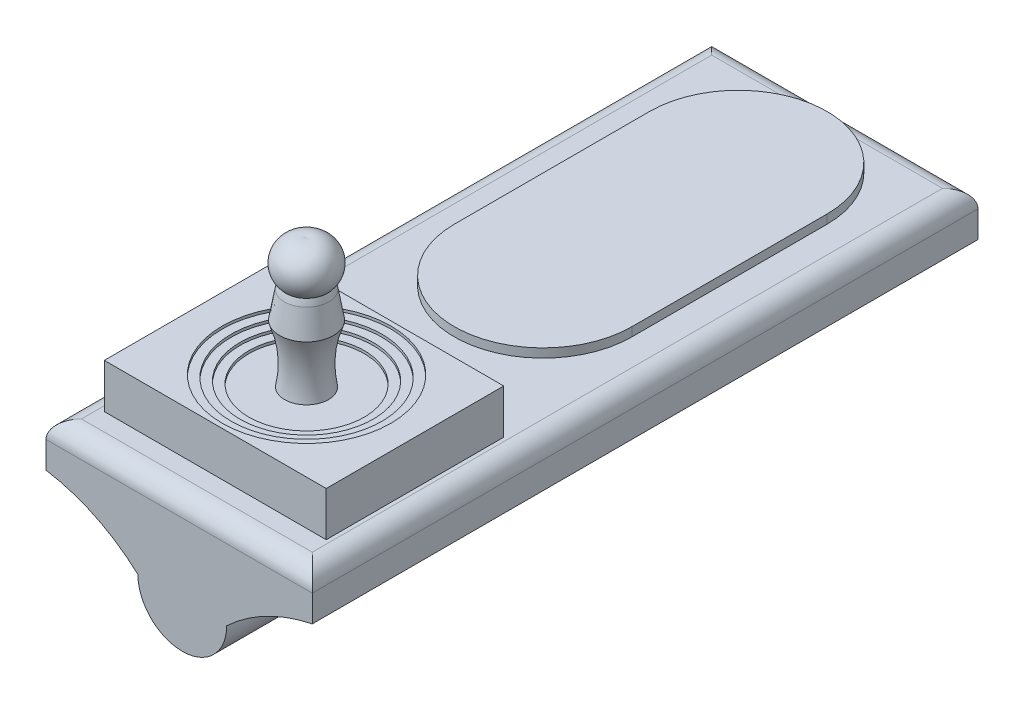
ISO-10303-21;
HEADER;
FILE_DESCRIPTION(('STEP AP214'),'2;1');
FILE_NAME('part.step','',(''),(''),'','','');
FILE_SCHEMA(('AUTOMOTIVE_DESIGN { 1 0 10303 214 1 1 1 1 }'));
ENDSEC;
DATA;
#1=APPLICATION_CONTEXT('core data for automotive mechanical design processes');
#2=APPLICATION_PROTOCOL_DEFINITION('international standard','automotive_design',2000,#1);
#3=PRODUCT_CONTEXT('',#1,'mechanical');
#4=PRODUCT('Part','Part','',(#3));
#5=PRODUCT_RELATED_PRODUCT_CATEGORY('part','',(#4));
#6=PRODUCT_DEFINITION_FORMATION('','',#4);
#7=PRODUCT_DEFINITION_CONTEXT('part definition',#1,'design');
#8=PRODUCT_DEFINITION('design','',#6,#7);
#9=PRODUCT_DEFINITION_SHAPE('','',#8);
#10=(LENGTH_UNIT() NAMED_UNIT(*) SI_UNIT(.MILLI.,.METRE.));
#11=(NAMED_UNIT(*) PLANE_ANGLE_UNIT() SI_UNIT($,.RADIAN.));
#12=(NAMED_UNIT(*) SI_UNIT($,.STERADIAN.) SOLID_ANGLE_UNIT());
#13=UNCERTAINTY_MEASURE_WITH_UNIT(LENGTH_MEASURE(1.E-05),#10,'distance_accuracy_value','');
#14=(GEOMETRIC_REPRESENTATION_CONTEXT(3) GLOBAL_UNCERTAINTY_ASSIGNED_CONTEXT((#13)) GLOBAL_UNIT_ASSIGNED_CONTEXT((#10,
#11,#12)) REPRESENTATION_CONTEXT('',''));
#15=CARTESIAN_POINT('',(0.,0.,0.));
#16=DIRECTION('',(0.,0.,1.));
#17=DIRECTION('',(1.,0.,0.));
#18=AXIS2_PLACEMENT_3D('',#15,#16,#17);
#19=CARTESIAN_POINT('',(-15.3558147471214,10.,-75.));
#20=DIRECTION('',(0.,1.,0.));
#21=DIRECTION('',(-1.,0.,0.));
#22=AXIS2_PLACEMENT_3D('',#19,#20,#21);
#23=PLANE('',#22);
#24=DIRECTION('',(0.,0.,1.));
#25=VECTOR('',#24,1.);
#26=CARTESIAN_POINT('',(12.6441852528786,10.,-75.));
#27=LINE('',#26,#25);
#28=CARTESIAN_POINT('',(12.6441852528786,10.,-2.));
#29=VERTEX_POINT('',#28);
#30=CARTESIAN_POINT('',(12.6441852528786,10.,-73.));
#31=VERTEX_POINT('',#30);
#32=EDGE_CURVE('E192',#29,#31,#27,.F.);
#33=ORIENTED_EDGE('',*,*,#32,.T.);
#34=DIRECTION('',(-1.,0.,0.));
#35=VECTOR('',#34,1.);
#36=CARTESIAN_POINT('',(-15.3558147471214,10.,-73.));
#37=LINE('',#36,#35);
#38=CARTESIAN_POINT('',(-0.355814747121413,10.,-73.));
#39=VERTEX_POINT('',#38);
#40=EDGE_CURVE('E198',#31,#39,#37,.T.);
#41=ORIENTED_EDGE('',*,*,#40,.T.);
#42=CARTESIAN_POINT('',(-0.355814747121413,10.,-63.));
#43=DIRECTION('',(0.,1.,0.));
#44=DIRECTION('',(-1.,0.,0.));
#45=AXIS2_PLACEMENT_3D('',#42,#43,#44);
#46=CIRCLE('',#45,10.);
#47=CARTESIAN_POINT('',(9.64418525287859,10.,-63.));
#48=VERTEX_POINT('',#47);
#49=EDGE_CURVE('E239',#48,#39,#46,.T.);
#50=ORIENTED_EDGE('',*,*,#49,.F.);
#51=DIRECTION('',(0.,0.,-1.));
#52=VECTOR('',#51,1.);
#53=CARTESIAN_POINT('',(9.64418525287859,10.,-41.));
#54=LINE('',#53,#52);
#55=CARTESIAN_POINT('',(9.64418525287859,10.,-41.));
#56=VERTEX_POINT('',#55);
#57=EDGE_CURVE('E241',#56,#48,#54,.T.);
#58=ORIENTED_EDGE('',*,*,#57,.F.);
#59=CARTESIAN_POINT('',(-0.355814747121414,10.,-41.));
#60=DIRECTION('',(0.,1.,0.));
#61=DIRECTION('',(-1.,0.,0.));
#62=AXIS2_PLACEMENT_3D('',#59,#60,#61);
#63=CIRCLE('',#62,10.);
#64=CARTESIAN_POINT('',(-10.3558147471214,10.,-41.));
#65=VERTEX_POINT('',#64);
#66=EDGE_CURVE('E257',#65,#56,#63,.T.);
#67=ORIENTED_EDGE('',*,*,#66,.F.);
#68=DIRECTION('',(0.,0.,1.));
#69=VECTOR('',#68,1.);
#70=CARTESIAN_POINT('',(-10.3558147471214,10.,-41.));
#71=LINE('',#70,#69);
#72=CARTESIAN_POINT('',(-10.3558147471214,10.,-63.));
#73=VERTEX_POINT('',#72);
#74=EDGE_CURVE('E246',#73,#65,#71,.T.);
#75=ORIENTED_EDGE('',*,*,#74,.F.);
#76=EDGE_CURVE('E233',#39,#73,#46,.T.);
#77=ORIENTED_EDGE('',*,*,#76,.F.);
#78=DIRECTION('',(-1.,0.,0.));
#79=VECTOR('',#78,1.);
#80=CARTESIAN_POINT('',(-15.3558147471214,10.,-73.));
#81=LINE('',#80,#79);
#82=CARTESIAN_POINT('',(-13.3558147471214,10.,-73.));
#83=VERTEX_POINT('',#82);
#84=EDGE_CURVE('E195',#39,#83,#81,.T.);
#85=ORIENTED_EDGE('',*,*,#84,.T.);
#86=DIRECTION('',(0.,0.,1.));
#87=VECTOR('',#86,1.);
#88=CARTESIAN_POINT('',(-13.3558147471214,10.,-75.));
#89=LINE('',#88,#87);
#90=CARTESIAN_POINT('',(-13.3558147471214,10.,-2.));
#91=VERTEX_POINT('',#90);
#92=EDGE_CURVE('E185',#83,#91,#89,.T.);
#93=ORIENTED_EDGE('',*,*,#92,.T.);
#94=DIRECTION('',(-1.,0.,0.));
#95=VECTOR('',#94,1.);
#96=CARTESIAN_POINT('',(14.6441852528786,10.,-2.));
#97=LINE('',#96,#95);
#98=EDGE_CURVE('E188',#91,#29,#97,.F.);
#99=ORIENTED_EDGE('',*,*,#98,.T.);
#100=EDGE_LOOP('',(#33,#41,#50,#58,#67,#75,#77,#85,#93,#99));
#101=FACE_BOUND('',#100,.T.);
#102=DIRECTION('',(-1.,0.,0.));
#103=VECTOR('',#102,1.);
#104=CARTESIAN_POINT('',(-12.7865518298798,10.,-24.));
#105=LINE('',#104,#103);
#106=CARTESIAN_POINT('',(12.2134481701202,10.,-24.));
#107=VERTEX_POINT('',#106);
#108=CARTESIAN_POINT('',(-12.7865518298798,10.,-24.));
#109=VERTEX_POINT('',#108);
#110=EDGE_CURVE('E810',#107,#109,#105,.T.);
#111=ORIENTED_EDGE('',*,*,#110,.F.);
#112=DIRECTION('',(0.,0.,-1.));
#113=VECTOR('',#112,1.);
#114=CARTESIAN_POINT('',(12.2134481701202,10.,-24.));
#115=LINE('',#114,#113);
#116=CARTESIAN_POINT('',(12.2134481701202,10.,-4.));
#117=VERTEX_POINT('',#116);
#118=EDGE_CURVE('E788',#117,#107,#115,.T.);
#119=ORIENTED_EDGE('',*,*,#118,.F.);
#120=DIRECTION('',(1.,0.,0.));
#121=VECTOR('',#120,1.);
#122=CARTESIAN_POINT('',(-12.7865518298798,10.,-4.));
#123=LINE('',#122,#121);
#124=CARTESIAN_POINT('',(-12.7865518298798,10.,-4.));
#125=VERTEX_POINT('',#124);
#126=EDGE_CURVE('E797',#125,#117,#123,.T.);
#127=ORIENTED_EDGE('',*,*,#126,.F.);
#128=DIRECTION('',(0.,0.,1.));
#129=VECTOR('',#128,1.);
#130=CARTESIAN_POINT('',(-12.7865518298798,10.,-24.));
#131=LINE('',#130,#129);
#132=EDGE_CURVE('E813',#109,#125,#131,.T.);
#133=ORIENTED_EDGE('',*,*,#132,.F.);
#134=EDGE_LOOP('',(#111,#119,#127,#133));
#135=FACE_BOUND('',#134,.T.);
#136=ADVANCED_FACE('F42',(#101,#135),#23,.T.);
#137=CARTESIAN_POINT('',(14.6441852528786,10.,-75.));
#138=DIRECTION('',(1.,0.,0.));
#139=DIRECTION('',(0.,0.,-1.));
#140=AXIS2_PLACEMENT_3D('',#137,#138,#139);
#141=PLANE('',#140);
#142=DIRECTION('',(0.,1.,0.));
#143=VECTOR('',#142,1.);
#144=CARTESIAN_POINT('',(14.6441852528786,10.,-75.));
#145=LINE('',#144,#143);
#146=CARTESIAN_POINT('',(14.6441852528786,5.,-75.));
#147=VERTEX_POINT('',#146);
#148=CARTESIAN_POINT('',(14.6441852528786,8.,-75.));
#149=VERTEX_POINT('',#148);
#150=EDGE_CURVE('E282',#147,#149,#145,.T.);
#151=ORIENTED_EDGE('',*,*,#150,.T.);
#152=DIRECTION('',(0.,0.,1.));
#153=VECTOR('',#152,1.);
#154=CARTESIAN_POINT('',(14.6441852528786,8.,-75.));
#155=LINE('',#154,#153);
#156=CARTESIAN_POINT('',(14.6441852528786,8.,0.));
#157=VERTEX_POINT('',#156);
#158=EDGE_CURVE('E67',#149,#157,#155,.T.);
#159=ORIENTED_EDGE('',*,*,#158,.T.);
#160=DIRECTION('',(0.,1.,0.));
#161=VECTOR('',#160,1.);
#162=CARTESIAN_POINT('',(14.6441852528786,10.,0.));
#163=LINE('',#162,#161);
#164=CARTESIAN_POINT('',(14.6441852528786,5.,0.));
#165=VERTEX_POINT('',#164);
#166=EDGE_CURVE('E278',#165,#157,#163,.T.);
#167=ORIENTED_EDGE('',*,*,#166,.F.);
#168=DIRECTION('',(0.,0.,1.));
#169=VECTOR('',#168,1.);
#170=CARTESIAN_POINT('',(14.6441852528786,5.,-75.));
#171=LINE('',#170,#169);
#172=EDGE_CURVE('E189',#147,#165,#171,.T.);
#173=ORIENTED_EDGE('',*,*,#172,.F.);
#174=EDGE_LOOP('',(#151,#159,#167,#173));
#175=FACE_BOUND('',#174,.T.);
#176=ADVANCED_FACE('F343',(#175),#141,.T.);
#177=CARTESIAN_POINT('',(18.6814582616072,-14.5882726817091,-75.));
#178=DIRECTION('',(0.,0.,1.));
#179=DIRECTION('',(1.,0.,0.));
#180=AXIS2_PLACEMENT_3D('',#177,#178,#179);
#181=CYLINDRICAL_SURFACE('',#180,20.);
#182=CARTESIAN_POINT('',(18.6814582616072,-14.5882726817091,0.));
#183=DIRECTION('',(0.,0.,-1.));
#184=DIRECTION('',(-1.,0.,0.));
#185=AXIS2_PLACEMENT_3D('',#182,#183,#184);
#186=CIRCLE('',#185,20.);
#187=CARTESIAN_POINT('',(5.,0.,0.));
#188=VERTEX_POINT('',#187);
#189=EDGE_CURVE('E286',#188,#165,#186,.T.);
#190=ORIENTED_EDGE('',*,*,#189,.F.);
#191=DIRECTION('',(0.,0.,1.));
#192=VECTOR('',#191,1.);
#193=CARTESIAN_POINT('',(5.,0.,-75.));
#194=LINE('',#193,#192);
#195=CARTESIAN_POINT('',(5.,0.,-75.));
#196=VERTEX_POINT('',#195);
#197=EDGE_CURVE('E320',#196,#188,#194,.T.);
#198=ORIENTED_EDGE('',*,*,#197,.F.);
#199=CARTESIAN_POINT('',(18.6814582616072,-14.5882726817091,-75.));
#200=DIRECTION('',(0.,0.,-1.));
#201=DIRECTION('',(-1.,0.,0.));
#202=AXIS2_PLACEMENT_3D('',#199,#200,#201);
#203=CIRCLE('',#202,20.);
#204=EDGE_CURVE('E297',#196,#147,#203,.T.);
#205=ORIENTED_EDGE('',*,*,#204,.T.);
#206=ORIENTED_EDGE('',*,*,#172,.T.);
#207=EDGE_LOOP('',(#190,#198,#205,#206));
#208=FACE_BOUND('',#207,.T.);
#209=ADVANCED_FACE('F340',(#208),#181,.F.);
#210=CARTESIAN_POINT('',(0.,0.,-75.));
#211=DIRECTION('',(0.,0.,1.));
#212=DIRECTION('',(1.,0.,0.));
#213=AXIS2_PLACEMENT_3D('',#210,#211,#212);
#214=CYLINDRICAL_SURFACE('',#213,5.);
#215=CARTESIAN_POINT('',(0.,0.,0.));
#216=DIRECTION('',(0.,0.,1.));
#217=DIRECTION('',(1.,0.,0.));
#218=AXIS2_PLACEMENT_3D('',#215,#216,#217);
#219=CIRCLE('',#218,5.);
#220=CARTESIAN_POINT('',(-5.,0.,0.));
#221=VERTEX_POINT('',#220);
#222=EDGE_CURVE('E311',#221,#188,#219,.T.);
#223=ORIENTED_EDGE('',*,*,#222,.F.);
#224=DIRECTION('',(0.,0.,1.));
#225=VECTOR('',#224,1.);
#226=CARTESIAN_POINT('',(-5.,0.,-75.));
#227=LINE('',#226,#225);
#228=CARTESIAN_POINT('',(-5.,0.,-75.));
#229=VERTEX_POINT('',#228);
#230=EDGE_CURVE('E323',#229,#221,#227,.T.);
#231=ORIENTED_EDGE('',*,*,#230,.F.);
#232=CARTESIAN_POINT('',(0.,0.,-75.));
#233=DIRECTION('',(0.,0.,1.));
#234=DIRECTION('',(1.,0.,0.));
#235=AXIS2_PLACEMENT_3D('',#232,#233,#234);
#236=CIRCLE('',#235,5.);
#237=EDGE_CURVE('E293',#229,#196,#236,.T.);
#238=ORIENTED_EDGE('',*,*,#237,.T.);
#239=ORIENTED_EDGE('',*,*,#197,.T.);
#240=EDGE_LOOP('',(#223,#231,#238,#239));
#241=FACE_BOUND('',#240,.T.);
#242=ADVANCED_FACE('F351',(#241),#214,.T.);
#243=CARTESIAN_POINT('',(-18.5066784067701,-14.7502419782216,-75.));
#244=DIRECTION('',(0.,0.,1.));
#245=DIRECTION('',(1.,0.,0.));
#246=AXIS2_PLACEMENT_3D('',#243,#244,#245);
#247=CYLINDRICAL_SURFACE('',#246,20.);
#248=CARTESIAN_POINT('',(-18.5066784067701,-14.7502419782216,0.));
#249=DIRECTION('',(0.,0.,-1.));
#250=DIRECTION('',(-1.,0.,0.));
#251=AXIS2_PLACEMENT_3D('',#248,#249,#250);
#252=CIRCLE('',#251,20.);
#253=CARTESIAN_POINT('',(-15.3558147471214,5.,0.));
#254=VERTEX_POINT('',#253);
#255=EDGE_CURVE('E307',#254,#221,#252,.T.);
#256=ORIENTED_EDGE('',*,*,#255,.F.);
#257=DIRECTION('',(0.,0.,1.));
#258=VECTOR('',#257,1.);
#259=CARTESIAN_POINT('',(-15.3558147471214,5.,-75.));
#260=LINE('',#259,#258);
#261=CARTESIAN_POINT('',(-15.3558147471214,5.,-75.));
#262=VERTEX_POINT('',#261);
#263=EDGE_CURVE('E301',#262,#254,#260,.T.);
#264=ORIENTED_EDGE('',*,*,#263,.F.);
#265=CARTESIAN_POINT('',(-18.5066784067701,-14.7502419782216,-75.));
#266=DIRECTION('',(0.,0.,-1.));
#267=DIRECTION('',(-1.,0.,0.));
#268=AXIS2_PLACEMENT_3D('',#265,#266,#267);
#269=CIRCLE('',#268,20.);
#270=EDGE_CURVE('E289',#262,#229,#269,.T.);
#271=ORIENTED_EDGE('',*,*,#270,.T.);
#272=ORIENTED_EDGE('',*,*,#230,.T.);
#273=EDGE_LOOP('',(#256,#264,#271,#272));
#274=FACE_BOUND('',#273,.T.);
#275=ADVANCED_FACE('F334',(#274),#247,.F.);
#276=CARTESIAN_POINT('',(-15.3558147471214,10.,-75.));
#277=DIRECTION('',(-1.,0.,0.));
#278=DIRECTION('',(0.,0.,1.));
#279=AXIS2_PLACEMENT_3D('',#276,#277,#278);
#280=PLANE('',#279);
#281=DIRECTION('',(0.,-1.,0.));
#282=VECTOR('',#281,1.);
#283=CARTESIAN_POINT('',(-15.3558147471214,10.,0.));
#284=LINE('',#283,#282);
#285=CARTESIAN_POINT('',(-15.3558147471214,8.,0.));
#286=VERTEX_POINT('',#285);
#287=EDGE_CURVE('E304',#286,#254,#284,.T.);
#288=ORIENTED_EDGE('',*,*,#287,.F.);
#289=DIRECTION('',(0.,0.,1.));
#290=VECTOR('',#289,1.);
#291=CARTESIAN_POINT('',(-15.3558147471214,8.,-75.));
#292=LINE('',#291,#290);
#293=CARTESIAN_POINT('',(-15.3558147471214,8.,-75.));
#294=VERTEX_POINT('',#293);
#295=EDGE_CURVE('E11',#286,#294,#292,.F.);
#296=ORIENTED_EDGE('',*,*,#295,.T.);
#297=DIRECTION('',(0.,-1.,0.));
#298=VECTOR('',#297,1.);
#299=CARTESIAN_POINT('',(-15.3558147471214,10.,-75.));
#300=LINE('',#299,#298);
#301=EDGE_CURVE('E285',#294,#262,#300,.T.);
#302=ORIENTED_EDGE('',*,*,#301,.T.);
#303=ORIENTED_EDGE('',*,*,#263,.T.);
#304=EDGE_LOOP('',(#288,#296,#302,#303));
#305=FACE_BOUND('',#304,.T.);
#306=ADVANCED_FACE('F330',(#305),#280,.T.);
#307=CARTESIAN_POINT('',(18.6814582616072,-14.5882726817091,-75.));
#308=DIRECTION('',(0.,0.,-1.));
#309=DIRECTION('',(-1.,0.,0.));
#310=AXIS2_PLACEMENT_3D('',#307,#308,#309);
#311=PLANE('',#310);
#312=CARTESIAN_POINT('',(0.,0.,-75.));
#313=DIRECTION('',(0.,0.,-1.));
#314=DIRECTION('',(-1.,0.,0.));
#315=AXIS2_PLACEMENT_3D('',#312,#313,#314);
#316=CIRCLE('',#315,4.);
#317=CARTESIAN_POINT('',(-4.,0.,-75.));
#318=VERTEX_POINT('',#317);
#319=EDGE_CURVE('E267',#318,#318,#316,.T.);
#320=ORIENTED_EDGE('',*,*,#319,.F.);
#321=EDGE_LOOP('',(#320));
#322=FACE_BOUND('',#321,.T.);
#323=ORIENTED_EDGE('',*,*,#301,.F.);
#324=DIRECTION('',(-1.,0.,0.));
#325=VECTOR('',#324,1.);
#326=CARTESIAN_POINT('',(18.6814582616072,8.,-75.));
#327=LINE('',#326,#325);
#328=EDGE_CURVE('E202',#294,#149,#327,.F.);
#329=ORIENTED_EDGE('',*,*,#328,.T.);
#330=ORIENTED_EDGE('',*,*,#150,.F.);
#331=ORIENTED_EDGE('',*,*,#204,.F.);
#332=ORIENTED_EDGE('',*,*,#237,.F.);
#333=ORIENTED_EDGE('',*,*,#270,.F.);
#334=EDGE_LOOP('',(#323,#329,#330,#331,#332,#333));
#335=FACE_BOUND('',#334,.T.);
#336=ADVANCED_FACE('F366',(#322,#335),#311,.T.);
#337=CARTESIAN_POINT('',(18.6814582616072,-14.5882726817091,0.));
#338=DIRECTION('',(0.,0.,-1.));
#339=DIRECTION('',(-1.,0.,0.));
#340=AXIS2_PLACEMENT_3D('',#337,#338,#339);
#341=PLANE('',#340);
#342=ORIENTED_EDGE('',*,*,#166,.T.);
#343=DIRECTION('',(-1.,0.,0.));
#344=VECTOR('',#343,1.);
#345=CARTESIAN_POINT('',(-15.3558147471214,8.,0.));
#346=LINE('',#345,#344);
#347=EDGE_CURVE('E52',#157,#286,#346,.T.);
#348=ORIENTED_EDGE('',*,*,#347,.T.);
#349=ORIENTED_EDGE('',*,*,#287,.T.);
#350=ORIENTED_EDGE('',*,*,#255,.T.);
#351=ORIENTED_EDGE('',*,*,#222,.T.);
#352=ORIENTED_EDGE('',*,*,#189,.T.);
#353=EDGE_LOOP('',(#342,#348,#349,#350,#351,#352));
#354=FACE_BOUND('',#353,.T.);
#355=ADVANCED_FACE('F336',(#354),#341,.F.);
#356=CARTESIAN_POINT('',(0.,0.,-15.));
#357=DIRECTION('',(0.,0.,-1.));
#358=DIRECTION('',(-1.,0.,0.));
#359=AXIS2_PLACEMENT_3D('',#356,#357,#358);
#360=CYLINDRICAL_SURFACE('',#359,4.);
#361=CARTESIAN_POINT('',(0.,0.,-15.));
#362=DIRECTION('',(0.,0.,-1.));
#363=DIRECTION('',(-1.,0.,0.));
#364=AXIS2_PLACEMENT_3D('',#361,#362,#363);
#365=CIRCLE('',#364,4.);
#366=CARTESIAN_POINT('',(-4.,0.,-15.));
#367=VERTEX_POINT('',#366);
#368=EDGE_CURVE('E274',#367,#367,#365,.T.);
#369=ORIENTED_EDGE('',*,*,#368,.F.);
#370=EDGE_LOOP('',(#369));
#371=FACE_BOUND('',#370,.T.);
#372=ORIENTED_EDGE('',*,*,#319,.T.);
#373=EDGE_LOOP('',(#372));
#374=FACE_BOUND('',#373,.T.);
#375=ADVANCED_FACE('F383',(#371,#374),#360,.F.);
#376=CARTESIAN_POINT('',(0.,0.,-15.));
#377=DIRECTION('',(0.,0.,-1.));
#378=DIRECTION('',(-1.,0.,0.));
#379=AXIS2_PLACEMENT_3D('',#376,#377,#378);
#380=PLANE('',#379);
#381=ORIENTED_EDGE('',*,*,#368,.T.);
#382=EDGE_LOOP('',(#381));
#383=FACE_BOUND('',#382,.T.);
#384=ADVANCED_FACE('F388',(#383),#380,.T.);
#385=CARTESIAN_POINT('',(-0.355814747121414,11.,-41.));
#386=DIRECTION('',(0.,-1.,0.));
#387=DIRECTION('',(1.,0.,0.));
#388=AXIS2_PLACEMENT_3D('',#385,#386,#387);
#389=CYLINDRICAL_SURFACE('',#388,10.);
#390=ORIENTED_EDGE('',*,*,#66,.T.);
#391=DIRECTION('',(0.,-1.,0.));
#392=VECTOR('',#391,1.);
#393=CARTESIAN_POINT('',(9.64418525287859,11.,-41.));
#394=LINE('',#393,#392);
#395=CARTESIAN_POINT('',(9.64418525287859,11.,-41.));
#396=VERTEX_POINT('',#395);
#397=EDGE_CURVE('E254',#396,#56,#394,.T.);
#398=ORIENTED_EDGE('',*,*,#397,.F.);
#399=CARTESIAN_POINT('',(-0.355814747121414,11.,-41.));
#400=DIRECTION('',(0.,1.,0.));
#401=DIRECTION('',(-1.,0.,0.));
#402=AXIS2_PLACEMENT_3D('',#399,#400,#401);
#403=CIRCLE('',#402,10.);
#404=CARTESIAN_POINT('',(-10.3558147471214,11.,-41.));
#405=VERTEX_POINT('',#404);
#406=EDGE_CURVE('E832',#405,#396,#403,.T.);
#407=ORIENTED_EDGE('',*,*,#406,.F.);
#408=DIRECTION('',(0.,-1.,0.));
#409=VECTOR('',#408,1.);
#410=CARTESIAN_POINT('',(-10.3558147471214,11.,-41.));
#411=LINE('',#410,#409);
#412=EDGE_CURVE('E270',#405,#65,#411,.T.);
#413=ORIENTED_EDGE('',*,*,#412,.T.);
#414=EDGE_LOOP('',(#390,#398,#407,#413));
#415=FACE_BOUND('',#414,.T.);
#416=ADVANCED_FACE('F392',(#415),#389,.T.);
#417=CARTESIAN_POINT('',(9.64418525287859,11.,-41.));
#418=DIRECTION('',(-1.,0.,0.));
#419=DIRECTION('',(0.,-1.,0.));
#420=AXIS2_PLACEMENT_3D('',#417,#418,#419);
#421=PLANE('',#420);
#422=ORIENTED_EDGE('',*,*,#57,.T.);
#423=DIRECTION('',(0.,-1.,0.));
#424=VECTOR('',#423,1.);
#425=CARTESIAN_POINT('',(9.64418525287859,11.,-63.));
#426=LINE('',#425,#424);
#427=CARTESIAN_POINT('',(9.64418525287859,11.,-63.));
#428=VERTEX_POINT('',#427);
#429=EDGE_CURVE('E251',#428,#48,#426,.T.);
#430=ORIENTED_EDGE('',*,*,#429,.F.);
#431=DIRECTION('',(0.,0.,-1.));
#432=VECTOR('',#431,1.);
#433=CARTESIAN_POINT('',(9.64418525287859,11.,-41.));
#434=LINE('',#433,#432);
#435=EDGE_CURVE('E836',#396,#428,#434,.T.);
#436=ORIENTED_EDGE('',*,*,#435,.F.);
#437=ORIENTED_EDGE('',*,*,#397,.T.);
#438=EDGE_LOOP('',(#422,#430,#436,#437));
#439=FACE_BOUND('',#438,.T.);
#440=ADVANCED_FACE('F250',(#439),#421,.F.);
#441=CARTESIAN_POINT('',(-0.355814747121413,11.,-63.));
#442=DIRECTION('',(0.,-1.,0.));
#443=DIRECTION('',(1.,0.,0.));
#444=AXIS2_PLACEMENT_3D('',#441,#442,#443);
#445=CYLINDRICAL_SURFACE('',#444,10.);
#446=ORIENTED_EDGE('',*,*,#49,.T.);
#447=ORIENTED_EDGE('',*,*,#76,.T.);
#448=DIRECTION('',(0.,-1.,0.));
#449=VECTOR('',#448,1.);
#450=CARTESIAN_POINT('',(-10.3558147471214,11.,-63.));
#451=LINE('',#450,#449);
#452=CARTESIAN_POINT('',(-10.3558147471214,11.,-63.));
#453=VERTEX_POINT('',#452);
#454=EDGE_CURVE('E263',#453,#73,#451,.T.);
#455=ORIENTED_EDGE('',*,*,#454,.F.);
#456=CARTESIAN_POINT('',(-0.355814747121413,11.,-63.));
#457=DIRECTION('',(0.,1.,0.));
#458=DIRECTION('',(-1.,0.,0.));
#459=AXIS2_PLACEMENT_3D('',#456,#457,#458);
#460=CIRCLE('',#459,10.);
#461=EDGE_CURVE('E261',#428,#453,#460,.T.);
#462=ORIENTED_EDGE('',*,*,#461,.F.);
#463=ORIENTED_EDGE('',*,*,#429,.T.);
#464=EDGE_LOOP('',(#446,#447,#455,#462,#463));
#465=FACE_BOUND('',#464,.T.);
#466=ADVANCED_FACE('F259',(#465),#445,.T.);
#467=CARTESIAN_POINT('',(-10.3558147471214,11.,-41.));
#468=DIRECTION('',(1.,0.,0.));
#469=DIRECTION('',(0.,1.,0.));
#470=AXIS2_PLACEMENT_3D('',#467,#468,#469);
#471=PLANE('',#470);
#472=ORIENTED_EDGE('',*,*,#74,.T.);
#473=ORIENTED_EDGE('',*,*,#412,.F.);
#474=DIRECTION('',(0.,0.,1.));
#475=VECTOR('',#474,1.);
#476=CARTESIAN_POINT('',(-10.3558147471214,11.,-41.));
#477=LINE('',#476,#475);
#478=EDGE_CURVE('E841',#453,#405,#477,.T.);
#479=ORIENTED_EDGE('',*,*,#478,.F.);
#480=ORIENTED_EDGE('',*,*,#454,.T.);
#481=EDGE_LOOP('',(#472,#473,#479,#480));
#482=FACE_BOUND('',#481,.T.);
#483=ADVANCED_FACE('F401',(#482),#471,.F.);
#484=CARTESIAN_POINT('',(-0.355814747121414,11.,-41.));
#485=DIRECTION('',(0.,1.,0.));
#486=DIRECTION('',(-1.,0.,0.));
#487=AXIS2_PLACEMENT_3D('',#484,#485,#486);
#488=PLANE('',#487);
#489=ORIENTED_EDGE('',*,*,#406,.T.);
#490=ORIENTED_EDGE('',*,*,#435,.T.);
#491=ORIENTED_EDGE('',*,*,#461,.T.);
#492=ORIENTED_EDGE('',*,*,#478,.T.);
#493=EDGE_LOOP('',(#489,#490,#491,#492));
#494=FACE_BOUND('',#493,.T.);
#495=ADVANCED_FACE('F404',(#494),#488,.T.);
#496=CARTESIAN_POINT('',(12.2134481701202,15.,-24.));
#497=DIRECTION('',(-1.,0.,0.));
#498=DIRECTION('',(0.,0.,1.));
#499=AXIS2_PLACEMENT_3D('',#496,#497,#498);
#500=PLANE('',#499);
#501=ORIENTED_EDGE('',*,*,#118,.T.);
#502=DIRECTION('',(0.,-1.,0.));
#503=VECTOR('',#502,1.);
#504=CARTESIAN_POINT('',(12.2134481701202,15.,-24.));
#505=LINE('',#504,#503);
#506=CARTESIAN_POINT('',(12.2134481701202,15.,-24.));
#507=VERTEX_POINT('',#506);
#508=EDGE_CURVE('E829',#507,#107,#505,.T.);
#509=ORIENTED_EDGE('',*,*,#508,.F.);
#510=DIRECTION('',(0.,0.,-1.));
#511=VECTOR('',#510,1.);
#512=CARTESIAN_POINT('',(12.2134481701202,15.,-24.));
#513=LINE('',#512,#511);
#514=CARTESIAN_POINT('',(12.2134481701202,15.,-4.));
#515=VERTEX_POINT('',#514);
#516=EDGE_CURVE('E792',#515,#507,#513,.T.);
#517=ORIENTED_EDGE('',*,*,#516,.F.);
#518=DIRECTION('',(0.,-1.,0.));
#519=VECTOR('',#518,1.);
#520=CARTESIAN_POINT('',(12.2134481701202,15.,-4.));
#521=LINE('',#520,#519);
#522=EDGE_CURVE('E806',#515,#117,#521,.T.);
#523=ORIENTED_EDGE('',*,*,#522,.T.);
#524=EDGE_LOOP('',(#501,#509,#517,#523));
#525=FACE_BOUND('',#524,.T.);
#526=ADVANCED_FACE('F408',(#525),#500,.F.);
#527=CARTESIAN_POINT('',(-12.7865518298798,15.,-24.));
#528=DIRECTION('',(0.,0.,1.));
#529=DIRECTION('',(1.,0.,0.));
#530=AXIS2_PLACEMENT_3D('',#527,#528,#529);
#531=PLANE('',#530);
#532=ORIENTED_EDGE('',*,*,#110,.T.);
#533=DIRECTION('',(0.,-1.,0.));
#534=VECTOR('',#533,1.);
#535=CARTESIAN_POINT('',(-12.7865518298798,15.,-24.));
#536=LINE('',#535,#534);
#537=CARTESIAN_POINT('',(-12.7865518298798,15.,-24.));
#538=VERTEX_POINT('',#537);
#539=EDGE_CURVE('E825',#538,#109,#536,.T.);
#540=ORIENTED_EDGE('',*,*,#539,.F.);
#541=DIRECTION('',(-1.,0.,0.));
#542=VECTOR('',#541,1.);
#543=CARTESIAN_POINT('',(-12.7865518298798,15.,-24.));
#544=LINE('',#543,#542);
#545=EDGE_CURVE('E796',#507,#538,#544,.T.);
#546=ORIENTED_EDGE('',*,*,#545,.F.);
#547=ORIENTED_EDGE('',*,*,#508,.T.);
#548=EDGE_LOOP('',(#532,#540,#546,#547));
#549=FACE_BOUND('',#548,.T.);
#550=ADVANCED_FACE('F412',(#549),#531,.F.);
#551=CARTESIAN_POINT('',(-12.7865518298798,15.,-24.));
#552=DIRECTION('',(1.,0.,0.));
#553=DIRECTION('',(0.,0.,-1.));
#554=AXIS2_PLACEMENT_3D('',#551,#552,#553);
#555=PLANE('',#554);
#556=ORIENTED_EDGE('',*,*,#132,.T.);
#557=DIRECTION('',(0.,-1.,0.));
#558=VECTOR('',#557,1.);
#559=CARTESIAN_POINT('',(-12.7865518298798,15.,-4.));
#560=LINE('',#559,#558);
#561=CARTESIAN_POINT('',(-12.7865518298798,15.,-4.));
#562=VERTEX_POINT('',#561);
#563=EDGE_CURVE('E822',#562,#125,#560,.T.);
#564=ORIENTED_EDGE('',*,*,#563,.F.);
#565=DIRECTION('',(0.,0.,1.));
#566=VECTOR('',#565,1.);
#567=CARTESIAN_POINT('',(-12.7865518298798,15.,-24.));
#568=LINE('',#567,#566);
#569=EDGE_CURVE('E800',#538,#562,#568,.T.);
#570=ORIENTED_EDGE('',*,*,#569,.F.);
#571=ORIENTED_EDGE('',*,*,#539,.T.);
#572=EDGE_LOOP('',(#556,#564,#570,#571));
#573=FACE_BOUND('',#572,.T.);
#574=ADVANCED_FACE('F416',(#573),#555,.F.);
#575=CARTESIAN_POINT('',(-12.7865518298798,15.,-4.));
#576=DIRECTION('',(0.,0.,-1.));
#577=DIRECTION('',(-1.,0.,0.));
#578=AXIS2_PLACEMENT_3D('',#575,#576,#577);
#579=PLANE('',#578);
#580=ORIENTED_EDGE('',*,*,#126,.T.);
#581=ORIENTED_EDGE('',*,*,#522,.F.);
#582=DIRECTION('',(1.,0.,0.));
#583=VECTOR('',#582,1.);
#584=CARTESIAN_POINT('',(-12.7865518298798,15.,-4.));
#585=LINE('',#584,#583);
#586=EDGE_CURVE('E803',#562,#515,#585,.T.);
#587=ORIENTED_EDGE('',*,*,#586,.F.);
#588=ORIENTED_EDGE('',*,*,#563,.T.);
#589=EDGE_LOOP('',(#580,#581,#587,#588));
#590=FACE_BOUND('',#589,.T.);
#591=ADVANCED_FACE('F420',(#590),#579,.F.);
#592=CARTESIAN_POINT('',(0.,15.,0.));
#593=DIRECTION('',(0.,1.,0.));
#594=DIRECTION('',(0.,0.,1.));
#595=AXIS2_PLACEMENT_3D('',#592,#593,#594);
#596=PLANE('',#595);
#597=CARTESIAN_POINT('',(0.,15.,-14.));
#598=DIRECTION('',(0.,1.,0.));
#599=DIRECTION('',(0.,0.,1.));
#600=AXIS2_PLACEMENT_3D('',#597,#598,#599);
#601=CIRCLE('',#600,9.5);
#602=CARTESIAN_POINT('',(0.,15.,-4.5));
#603=VERTEX_POINT('',#602);
#604=EDGE_CURVE('E780',#603,#603,#601,.T.);
#605=ORIENTED_EDGE('',*,*,#604,.F.);
#606=EDGE_LOOP('',(#605));
#607=FACE_BOUND('',#606,.T.);
#608=ORIENTED_EDGE('',*,*,#516,.T.);
#609=ORIENTED_EDGE('',*,*,#545,.T.);
#610=ORIENTED_EDGE('',*,*,#569,.T.);
#611=ORIENTED_EDGE('',*,*,#586,.T.);
#612=EDGE_LOOP('',(#608,#609,#610,#611));
#613=FACE_BOUND('',#612,.T.);
#614=ADVANCED_FACE('F424',(#607,#613),#596,.T.);
#615=CARTESIAN_POINT('',(0.,14.7,-14.));
#616=DIRECTION('',(0.,1.,0.));
#617=DIRECTION('',(0.,0.,1.));
#618=AXIS2_PLACEMENT_3D('',#615,#616,#617);
#619=CYLINDRICAL_SURFACE('',#618,9.5);
#620=CARTESIAN_POINT('',(0.,14.7,-14.));
#621=DIRECTION('',(0.,1.,0.));
#622=DIRECTION('',(0.,0.,1.));
#623=AXIS2_PLACEMENT_3D('',#620,#621,#622);
#624=CIRCLE('',#623,9.5);
#625=CARTESIAN_POINT('',(0.,14.7,-4.5));
#626=VERTEX_POINT('',#625);
#627=EDGE_CURVE('E784',#626,#626,#624,.T.);
#628=ORIENTED_EDGE('',*,*,#627,.F.);
#629=EDGE_LOOP('',(#628));
#630=FACE_BOUND('',#629,.T.);
#631=ORIENTED_EDGE('',*,*,#604,.T.);
#632=EDGE_LOOP('',(#631));
#633=FACE_BOUND('',#632,.T.);
#634=ADVANCED_FACE('F428',(#630,#633),#619,.F.);
#635=CARTESIAN_POINT('',(0.,14.7,-14.));
#636=DIRECTION('',(0.,1.,0.));
#637=DIRECTION('',(0.,0.,1.));
#638=AXIS2_PLACEMENT_3D('',#635,#636,#637);
#639=PLANE('',#638);
#640=CARTESIAN_POINT('',(0.,14.7,-14.));
#641=DIRECTION('',(0.,1.,0.));
#642=DIRECTION('',(0.,0.,1.));
#643=AXIS2_PLACEMENT_3D('',#640,#641,#642);
#644=CIRCLE('',#643,8.5);
#645=CARTESIAN_POINT('',(0.,14.7,-5.5));
#646=VERTEX_POINT('',#645);
#647=EDGE_CURVE('E772',#646,#646,#644,.T.);
#648=ORIENTED_EDGE('',*,*,#647,.F.);
#649=EDGE_LOOP('',(#648));
#650=FACE_BOUND('',#649,.T.);
#651=ORIENTED_EDGE('',*,*,#627,.T.);
#652=EDGE_LOOP('',(#651));
#653=FACE_BOUND('',#652,.T.);
#654=ADVANCED_FACE('F432',(#650,#653),#639,.T.);
#655=CARTESIAN_POINT('',(0.,14.4,-14.));
#656=DIRECTION('',(0.,1.,0.));
#657=DIRECTION('',(0.,0.,1.));
#658=AXIS2_PLACEMENT_3D('',#655,#656,#657);
#659=CYLINDRICAL_SURFACE('',#658,8.5);
#660=CARTESIAN_POINT('',(0.,14.4,-14.));
#661=DIRECTION('',(0.,1.,0.));
#662=DIRECTION('',(0.,0.,1.));
#663=AXIS2_PLACEMENT_3D('',#660,#661,#662);
#664=CIRCLE('',#663,8.5);
#665=CARTESIAN_POINT('',(0.,14.4,-5.5));
#666=VERTEX_POINT('',#665);
#667=EDGE_CURVE('E776',#666,#666,#664,.T.);
#668=ORIENTED_EDGE('',*,*,#667,.F.);
#669=EDGE_LOOP('',(#668));
#670=FACE_BOUND('',#669,.T.);
#671=ORIENTED_EDGE('',*,*,#647,.T.);
#672=EDGE_LOOP('',(#671));
#673=FACE_BOUND('',#672,.T.);
#674=ADVANCED_FACE('F436',(#670,#673),#659,.F.);
#675=CARTESIAN_POINT('',(0.,14.4,-14.));
#676=DIRECTION('',(0.,1.,0.));
#677=DIRECTION('',(0.,0.,1.));
#678=AXIS2_PLACEMENT_3D('',#675,#676,#677);
#679=PLANE('',#678);
#680=CARTESIAN_POINT('',(0.,14.4,-14.));
#681=DIRECTION('',(0.,1.,0.));
#682=DIRECTION('',(0.,0.,1.));
#683=AXIS2_PLACEMENT_3D('',#680,#681,#682);
#684=CIRCLE('',#683,7.5);
#685=CARTESIAN_POINT('',(0.,14.4,-6.5));
#686=VERTEX_POINT('',#685);
#687=EDGE_CURVE('E764',#686,#686,#684,.T.);
#688=ORIENTED_EDGE('',*,*,#687,.F.);
#689=EDGE_LOOP('',(#688));
#690=FACE_BOUND('',#689,.T.);
#691=ORIENTED_EDGE('',*,*,#667,.T.);
#692=EDGE_LOOP('',(#691));
#693=FACE_BOUND('',#692,.T.);
#694=ADVANCED_FACE('F440',(#690,#693),#679,.T.);
#695=CARTESIAN_POINT('',(0.,14.1,-14.));
#696=DIRECTION('',(0.,1.,0.));
#697=DIRECTION('',(0.,0.,1.));
#698=AXIS2_PLACEMENT_3D('',#695,#696,#697);
#699=CYLINDRICAL_SURFACE('',#698,7.5);
#700=CARTESIAN_POINT('',(0.,14.1,-14.));
#701=DIRECTION('',(0.,1.,0.));
#702=DIRECTION('',(0.,0.,1.));
#703=AXIS2_PLACEMENT_3D('',#700,#701,#702);
#704=CIRCLE('',#703,7.5);
#705=CARTESIAN_POINT('',(0.,14.1,-6.5));
#706=VERTEX_POINT('',#705);
#707=EDGE_CURVE('E768',#706,#706,#704,.T.);
#708=ORIENTED_EDGE('',*,*,#707,.F.);
#709=EDGE_LOOP('',(#708));
#710=FACE_BOUND('',#709,.T.);
#711=ORIENTED_EDGE('',*,*,#687,.T.);
#712=EDGE_LOOP('',(#711));
#713=FACE_BOUND('',#712,.T.);
#714=ADVANCED_FACE('F444',(#710,#713),#699,.F.);
#715=CARTESIAN_POINT('',(0.,14.1,-14.));
#716=DIRECTION('',(0.,1.,0.));
#717=DIRECTION('',(0.,0.,1.));
#718=AXIS2_PLACEMENT_3D('',#715,#716,#717);
#719=PLANE('',#718);
#720=CARTESIAN_POINT('',(0.,14.1,-14.));
#721=DIRECTION('',(0.,1.,0.));
#722=DIRECTION('',(0.,0.,1.));
#723=AXIS2_PLACEMENT_3D('',#720,#721,#722);
#724=CIRCLE('',#723,6.5);
#725=CARTESIAN_POINT('',(0.,14.1,-7.5));
#726=VERTEX_POINT('',#725);
#727=EDGE_CURVE('E758',#726,#726,#724,.T.);
#728=ORIENTED_EDGE('',*,*,#727,.F.);
#729=EDGE_LOOP('',(#728));
#730=FACE_BOUND('',#729,.T.);
#731=ORIENTED_EDGE('',*,*,#707,.T.);
#732=EDGE_LOOP('',(#731));
#733=FACE_BOUND('',#732,.T.);
#734=ADVANCED_FACE('F448',(#730,#733),#719,.T.);
#735=CARTESIAN_POINT('',(0.,13.8,-14.));
#736=DIRECTION('',(0.,1.,0.));
#737=DIRECTION('',(0.,0.,1.));
#738=AXIS2_PLACEMENT_3D('',#735,#736,#737);
#739=CYLINDRICAL_SURFACE('',#738,6.5);
#740=CARTESIAN_POINT('',(0.,13.8,-14.));
#741=DIRECTION('',(0.,1.,0.));
#742=DIRECTION('',(0.,0.,1.));
#743=AXIS2_PLACEMENT_3D('',#740,#741,#742);
#744=CIRCLE('',#743,6.5);
#745=CARTESIAN_POINT('',(0.,13.8,-7.5));
#746=VERTEX_POINT('',#745);
#747=EDGE_CURVE('E760',#746,#746,#744,.T.);
#748=ORIENTED_EDGE('',*,*,#747,.F.);
#749=EDGE_LOOP('',(#748));
#750=FACE_BOUND('',#749,.T.);
#751=ORIENTED_EDGE('',*,*,#727,.T.);
#752=EDGE_LOOP('',(#751));
#753=FACE_BOUND('',#752,.T.);
#754=ADVANCED_FACE('F452',(#750,#753),#739,.F.);
#755=CARTESIAN_POINT('',(0.,13.8,-14.));
#756=DIRECTION('',(0.,1.,0.));
#757=DIRECTION('',(0.,0.,1.));
#758=AXIS2_PLACEMENT_3D('',#755,#756,#757);
#759=PLANE('',#758);
#760=CARTESIAN_POINT('',(0.,13.8,-14.));
#761=DIRECTION('',(0.,-1.,0.));
#762=DIRECTION('',(0.,0.,-1.));
#763=AXIS2_PLACEMENT_3D('',#760,#761,#762);
#764=CIRCLE('',#763,2.4756960641065);
#765=CARTESIAN_POINT('',(0.,13.8,-16.4756960641065));
#766=VERTEX_POINT('',#765);
#767=EDGE_CURVE('E183',#766,#766,#764,.T.);
#768=ORIENTED_EDGE('',*,*,#767,.T.);
#769=EDGE_LOOP('',(#768));
#770=FACE_BOUND('',#769,.T.);
#771=ORIENTED_EDGE('',*,*,#747,.T.);
#772=EDGE_LOOP('',(#771));
#773=FACE_BOUND('',#772,.T.);
#774=ADVANCED_FACE('F456',(#770,#773),#759,.T.);
#775=CARTESIAN_POINT('',(0.,16.0816938570892,-14.));
#776=DIRECTION('',(0.,-1.,0.));
#777=DIRECTION('',(0.,0.,-1.));
#778=AXIS2_PLACEMENT_3D('',#775,#776,#777);
#779=TOROIDAL_SURFACE('',#778,14.2567772174863,12.);
#780=ORIENTED_EDGE('',*,*,#767,.F.);
#781=EDGE_LOOP('',(#780));
#782=FACE_BOUND('',#781,.T.);
#783=CARTESIAN_POINT('',(0.,20.3336792656919,-14.));
#784=DIRECTION('',(0.,-1.,0.));
#785=DIRECTION('',(0.,0.,-1.));
#786=AXIS2_PLACEMENT_3D('',#783,#784,#785);
#787=CIRCLE('',#786,3.03534147668072);
#788=CARTESIAN_POINT('',(0.,20.3336792656919,-17.0353414766807));
#789=VERTEX_POINT('',#788);
#790=EDGE_CURVE('E177',#789,#789,#787,.T.);
#791=ORIENTED_EDGE('',*,*,#790,.T.);
#792=EDGE_LOOP('',(#791));
#793=FACE_BOUND('',#792,.T.);
#794=ADVANCED_FACE('F460',(#782,#793),#779,.F.);
#795=CARTESIAN_POINT('',(0.,23.3564623842134,-14.));
#796=DIRECTION('',(0.,-1.,0.));
#797=DIRECTION('',(0.,0.,-1.));
#798=AXIS2_PLACEMENT_3D('',#795,#796,#797);
#799=CONICAL_SURFACE('',#798,2.50565965310882,0.17346867491031);
#800=ORIENTED_EDGE('',*,*,#790,.F.);
#801=EDGE_LOOP('',(#800));
#802=FACE_BOUND('',#801,.T.);
#803=CARTESIAN_POINT('',(0.,23.3564623842134,-14.));
#804=DIRECTION('',(0.,-1.,0.));
#805=DIRECTION('',(0.,0.,-1.));
#806=AXIS2_PLACEMENT_3D('',#803,#804,#805);
#807=CIRCLE('',#806,2.50565965310882);
#808=CARTESIAN_POINT('',(0.,23.3564623842134,-16.5056596531088));
#809=VERTEX_POINT('',#808);
#810=EDGE_CURVE('E172',#809,#809,#807,.T.);
#811=ORIENTED_EDGE('',*,*,#810,.T.);
#812=EDGE_LOOP('',(#811));
#813=FACE_BOUND('',#812,.T.);
#814=ADVANCED_FACE('F464',(#802,#813),#799,.T.);
#815=CARTESIAN_POINT('',(0.,20.8676926351662,-14.));
#816=DIRECTION('',(0.,-1.,0.));
#817=DIRECTION('',(0.,0.,-1.));
#818=AXIS2_PLACEMENT_3D('',#815,#816,#817);
#819=DEGENERATE_TOROIDAL_SURFACE('',#818,7.40083925980589,10.2143377453143,.F.);
#820=CARTESIAN_POINT('',(0.,24.0645957781242,-14.));
#821=DIRECTION('',(0.,1.,0.));
#822=DIRECTION('',(0.,0.,1.));
#823=AXIS2_PLACEMENT_3D('',#820,#821,#822);
#824=CIRCLE('',#823,2.30032076721653);
#825=CARTESIAN_POINT('',(0.,24.0645957781242,-11.6996792327835));
#826=VERTEX_POINT('',#825);
#827=EDGE_CURVE('E169',#826,#826,#824,.F.);
#828=ORIENTED_EDGE('',*,*,#827,.T.);
#829=EDGE_LOOP('',(#828));
#830=FACE_BOUND('',#829,.T.);
#831=ORIENTED_EDGE('',*,*,#810,.F.);
#832=EDGE_LOOP('',(#831));
#833=FACE_BOUND('',#832,.T.);
#834=ADVANCED_FACE('F165',(#830,#833),#819,.F.);
#835=CARTESIAN_POINT('',(0.,25.9035486266933,-14.5267141969683));
#836=DIRECTION('',(-1.,0.,0.));
#837=DIRECTION('',(0.,0.,-1.));
#838=AXIS2_PLACEMENT_3D('',#835,#836,#837);
#839=CIRCLE('',#838,2.55488313730549);
#840=TRIMMED_CURVE('',#839,(PARAMETER_VALUE(-1.77844514790811)),
(PARAMETER_VALUE(1.77844514790811)),.T.,.PARAMETER.);
#841=CARTESIAN_POINT('',(0.,25.9035486266933,-14.));
#842=DIRECTION('',(0.,-1.,0.));
#843=AXIS1_PLACEMENT('',#841,#842);
#844=SURFACE_OF_REVOLUTION('',#840,#843);
#845=CARTESIAN_POINT('',(0.,28.4035486266933,-14.));
#846=VERTEX_POINT('',#845);
#847=VERTEX_LOOP('',#846);
#848=FACE_BOUND('',#847,.T.);
#849=ORIENTED_EDGE('',*,*,#827,.F.);
#850=EDGE_LOOP('',(#849));
#851=FACE_BOUND('',#850,.T.);
#852=ADVANCED_FACE('F162',(#848,#851),#844,.T.);
#853=CARTESIAN_POINT('',(18.6814582616072,8.,-2.));
#854=DIRECTION('',(1.,0.,0.));
#855=DIRECTION('',(0.,1.,0.));
#856=AXIS2_PLACEMENT_3D('',#853,#854,#855);
#857=CYLINDRICAL_SURFACE('',#856,2.);
#858=CARTESIAN_POINT('',(-13.3558147471214,8.,-2.));
#859=DIRECTION('',(0.707106781186547,0.,0.707106781186547));
#860=DIRECTION('',(-0.707106781186547,0.,0.707106781186547));
#861=AXIS2_PLACEMENT_3D('',#858,#859,#860);
#862=ELLIPSE('',#861,2.82842712474619,2.);
#863=EDGE_CURVE('E180',#286,#91,#862,.F.);
#864=ORIENTED_EDGE('',*,*,#863,.F.);
#865=ORIENTED_EDGE('',*,*,#347,.F.);
#866=CARTESIAN_POINT('',(12.6441852528786,8.,-2.));
#867=DIRECTION('',(0.707106781186547,0.,-0.707106781186547));
#868=DIRECTION('',(0.707106781186547,0.,0.707106781186547));
#869=AXIS2_PLACEMENT_3D('',#866,#867,#868);
#870=ELLIPSE('',#869,2.82842712474619,2.);
#871=EDGE_CURVE('E46',#29,#157,#870,.T.);
#872=ORIENTED_EDGE('',*,*,#871,.F.);
#873=ORIENTED_EDGE('',*,*,#98,.F.);
#874=EDGE_LOOP('',(#864,#865,#872,#873));
#875=FACE_BOUND('',#874,.T.);
#876=ADVANCED_FACE('F44',(#875),#857,.T.);
#877=CARTESIAN_POINT('',(12.6441852528786,8.,-75.));
#878=DIRECTION('',(0.,0.,1.));
#879=DIRECTION('',(1.,0.,0.));
#880=AXIS2_PLACEMENT_3D('',#877,#878,#879);
#881=CYLINDRICAL_SURFACE('',#880,2.);
#882=ORIENTED_EDGE('',*,*,#871,.T.);
#883=ORIENTED_EDGE('',*,*,#158,.F.);
#884=CARTESIAN_POINT('',(12.6441852528786,8.,-73.));
#885=DIRECTION('',(0.707106781186547,0.,0.707106781186547));
#886=DIRECTION('',(-0.707106781186547,0.,0.707106781186547));
#887=AXIS2_PLACEMENT_3D('',#884,#885,#886);
#888=ELLIPSE('',#887,2.82842712474619,2.);
#889=EDGE_CURVE('E214',#31,#149,#888,.F.);
#890=ORIENTED_EDGE('',*,*,#889,.F.);
#891=ORIENTED_EDGE('',*,*,#32,.F.);
#892=EDGE_LOOP('',(#882,#883,#890,#891));
#893=FACE_BOUND('',#892,.T.);
#894=ADVANCED_FACE('F359',(#893),#881,.T.);
#895=CARTESIAN_POINT('',(-13.3558147471214,8.,-75.));
#896=DIRECTION('',(0.,0.,1.));
#897=DIRECTION('',(1.,0.,0.));
#898=AXIS2_PLACEMENT_3D('',#895,#896,#897);
#899=CYLINDRICAL_SURFACE('',#898,2.);
#900=ORIENTED_EDGE('',*,*,#863,.T.);
#901=ORIENTED_EDGE('',*,*,#92,.F.);
#902=CARTESIAN_POINT('',(-13.3558147471214,8.,-73.));
#903=DIRECTION('',(-0.707106781186547,0.,0.707106781186547));
#904=DIRECTION('',(0.707106781186547,0.,0.707106781186547));
#905=AXIS2_PLACEMENT_3D('',#902,#903,#904);
#906=ELLIPSE('',#905,2.82842712474619,2.);
#907=EDGE_CURVE('E210',#294,#83,#906,.F.);
#908=ORIENTED_EDGE('',*,*,#907,.F.);
#909=ORIENTED_EDGE('',*,*,#295,.F.);
#910=EDGE_LOOP('',(#900,#901,#908,#909));
#911=FACE_BOUND('',#910,.T.);
#912=ADVANCED_FACE('F222',(#911),#899,.T.);
#913=CARTESIAN_POINT('',(-15.3558147471214,8.,-73.));
#914=DIRECTION('',(-1.,0.,0.));
#915=DIRECTION('',(0.,-1.,0.));
#916=AXIS2_PLACEMENT_3D('',#913,#914,#915);
#917=CYLINDRICAL_SURFACE('',#916,2.);
#918=ORIENTED_EDGE('',*,*,#889,.T.);
#919=ORIENTED_EDGE('',*,*,#328,.F.);
#920=ORIENTED_EDGE('',*,*,#907,.T.);
#921=ORIENTED_EDGE('',*,*,#84,.F.);
#922=ORIENTED_EDGE('',*,*,#40,.F.);
#923=EDGE_LOOP('',(#918,#919,#920,#921,#922));
#924=FACE_BOUND('',#923,.T.);
#925=ADVANCED_FACE('F237',(#924),#917,.T.);
#926=CLOSED_SHELL('',(#136,#176,#209,#242,#275,#306,#336,#355,#375,#384,#416,#440,#466,#483,
#495,#526,#550,#574,#591,#614,#634,#654,#674,#694,#714,#734,#754,#774,#794,#814,#834,#852,#876,
#894,#912,#925));
#927=MANIFOLD_SOLID_BREP('B2',#926);
#928=ADVANCED_BREP_SHAPE_REPRESENTATION('',(#18,#927),#14);
#929=SHAPE_DEFINITION_REPRESENTATION(#9,#928);
ENDSEC;
END-ISO-10303-21;
